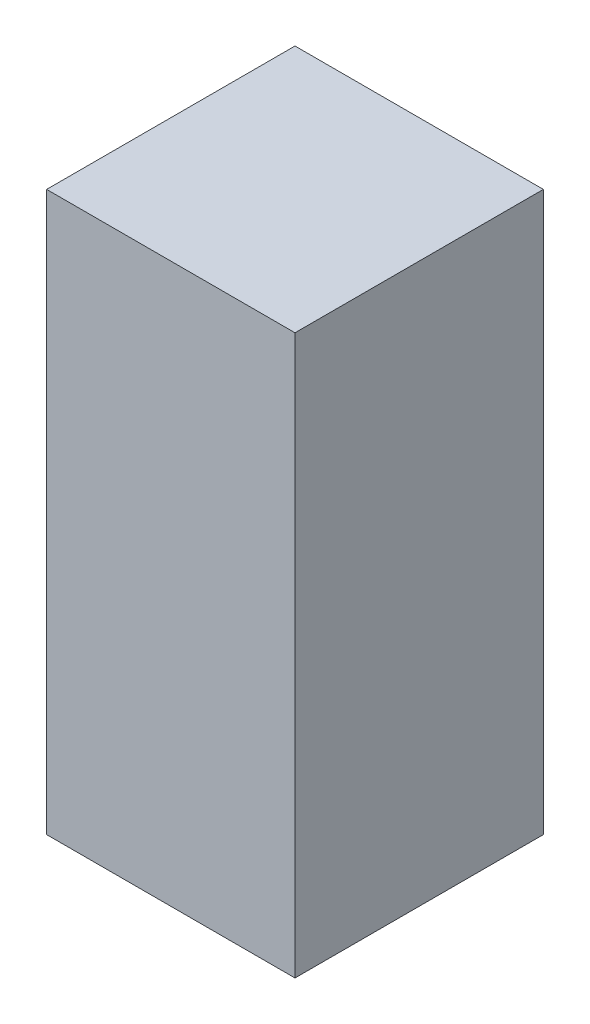
ISO-10303-21;
HEADER;
FILE_DESCRIPTION(('STEP AP214'),'2;1');
FILE_NAME('part.step','',(''),(''),'','','');
FILE_SCHEMA(('AUTOMOTIVE_DESIGN { 1 0 10303 214 1 1 1 1 }'));
ENDSEC;
DATA;
#1=APPLICATION_CONTEXT('core data for automotive mechanical design processes');
#2=APPLICATION_PROTOCOL_DEFINITION('international standard','automotive_design',2000,#1);
#3=PRODUCT_CONTEXT('',#1,'mechanical');
#4=PRODUCT('Part','Part','',(#3));
#5=PRODUCT_RELATED_PRODUCT_CATEGORY('part','',(#4));
#6=PRODUCT_DEFINITION_FORMATION('','',#4);
#7=PRODUCT_DEFINITION_CONTEXT('part definition',#1,'design');
#8=PRODUCT_DEFINITION('design','',#6,#7);
#9=PRODUCT_DEFINITION_SHAPE('','',#8);
#10=(LENGTH_UNIT() NAMED_UNIT(*) SI_UNIT(.MILLI.,.METRE.));
#11=(NAMED_UNIT(*) PLANE_ANGLE_UNIT() SI_UNIT($,.RADIAN.));
#12=(NAMED_UNIT(*) SI_UNIT($,.STERADIAN.) SOLID_ANGLE_UNIT());
#13=UNCERTAINTY_MEASURE_WITH_UNIT(LENGTH_MEASURE(1.E-05),#10,'distance_accuracy_value','');
#14=(GEOMETRIC_REPRESENTATION_CONTEXT(3) GLOBAL_UNCERTAINTY_ASSIGNED_CONTEXT((#13)) GLOBAL_UNIT_ASSIGNED_CONTEXT((#10,
#11,#12)) REPRESENTATION_CONTEXT('',''));
#15=CARTESIAN_POINT('',(0.,0.,0.));
#16=DIRECTION('',(0.,0.,1.));
#17=DIRECTION('',(1.,0.,0.));
#18=AXIS2_PLACEMENT_3D('',#15,#16,#17);
#19=CARTESIAN_POINT('',(502.5,552.,-247.5));
#20=DIRECTION('',(-1.,0.,0.));
#21=DIRECTION('',(0.,0.,1.));
#22=AXIS2_PLACEMENT_3D('',#19,#20,#21);
#23=PLANE('',#22);
#24=DIRECTION('',(0.,-1.,0.));
#25=VECTOR('',#24,1.);
#26=CARTESIAN_POINT('',(502.5,552.,-227.5));
#27=LINE('',#26,#25);
#28=CARTESIAN_POINT('',(502.5,597.,-227.5));
#29=VERTEX_POINT('',#28);
#30=CARTESIAN_POINT('',(502.5,552.,-227.5));
#31=VERTEX_POINT('',#30);
#32=EDGE_CURVE('E103',#29,#31,#27,.T.);
#33=ORIENTED_EDGE('',*,*,#32,.F.);
#34=DIRECTION('',(0.,0.,1.));
#35=VECTOR('',#34,1.);
#36=CARTESIAN_POINT('',(502.5,597.,-247.5));
#37=LINE('',#36,#35);
#38=CARTESIAN_POINT('',(502.5,597.,-247.5));
#39=VERTEX_POINT('',#38);
#40=EDGE_CURVE('E11',#39,#29,#37,.T.);
#41=ORIENTED_EDGE('',*,*,#40,.F.);
#42=DIRECTION('',(0.,-1.,0.));
#43=VECTOR('',#42,1.);
#44=CARTESIAN_POINT('',(502.5,552.,-247.5));
#45=LINE('',#44,#43);
#46=CARTESIAN_POINT('',(502.5,552.,-247.5));
#47=VERTEX_POINT('',#46);
#48=EDGE_CURVE('E97',#39,#47,#45,.T.);
#49=ORIENTED_EDGE('',*,*,#48,.T.);
#50=DIRECTION('',(0.,0.,1.));
#51=VECTOR('',#50,1.);
#52=CARTESIAN_POINT('',(502.5,552.,-247.5));
#53=LINE('',#52,#51);
#54=EDGE_CURVE('E42',#47,#31,#53,.T.);
#55=ORIENTED_EDGE('',*,*,#54,.T.);
#56=EDGE_LOOP('',(#33,#41,#49,#55));
#57=FACE_BOUND('',#56,.T.);
#58=ADVANCED_FACE('F39',(#57),#23,.T.);
#59=CARTESIAN_POINT('',(502.5,597.,-247.5));
#60=DIRECTION('',(0.,1.,0.));
#61=DIRECTION('',(0.,0.,1.));
#62=AXIS2_PLACEMENT_3D('',#59,#60,#61);
#63=PLANE('',#62);
#64=DIRECTION('',(-1.,0.,0.));
#65=VECTOR('',#64,1.);
#66=CARTESIAN_POINT('',(502.5,597.,-227.5));
#67=LINE('',#66,#65);
#68=CARTESIAN_POINT('',(522.5,597.,-227.5));
#69=VERTEX_POINT('',#68);
#70=EDGE_CURVE('E99',#69,#29,#67,.T.);
#71=ORIENTED_EDGE('',*,*,#70,.F.);
#72=DIRECTION('',(0.,0.,1.));
#73=VECTOR('',#72,1.);
#74=CARTESIAN_POINT('',(522.5,597.,-247.5));
#75=LINE('',#74,#73);
#76=CARTESIAN_POINT('',(522.5,597.,-247.5));
#77=VERTEX_POINT('',#76);
#78=EDGE_CURVE('E48',#77,#69,#75,.T.);
#79=ORIENTED_EDGE('',*,*,#78,.F.);
#80=DIRECTION('',(-1.,0.,0.));
#81=VECTOR('',#80,1.);
#82=CARTESIAN_POINT('',(502.5,597.,-247.5));
#83=LINE('',#82,#81);
#84=EDGE_CURVE('E94',#77,#39,#83,.T.);
#85=ORIENTED_EDGE('',*,*,#84,.T.);
#86=ORIENTED_EDGE('',*,*,#40,.T.);
#87=EDGE_LOOP('',(#71,#79,#85,#86));
#88=FACE_BOUND('',#87,.T.);
#89=ADVANCED_FACE('F113',(#88),#63,.T.);
#90=CARTESIAN_POINT('',(522.5,552.,-247.5));
#91=DIRECTION('',(1.,0.,0.));
#92=DIRECTION('',(0.,0.,-1.));
#93=AXIS2_PLACEMENT_3D('',#90,#91,#92);
#94=PLANE('',#93);
#95=DIRECTION('',(0.,1.,0.));
#96=VECTOR('',#95,1.);
#97=CARTESIAN_POINT('',(522.5,552.,-227.5));
#98=LINE('',#97,#96);
#99=CARTESIAN_POINT('',(522.5,552.,-227.5));
#100=VERTEX_POINT('',#99);
#101=EDGE_CURVE('E89',#100,#69,#98,.T.);
#102=ORIENTED_EDGE('',*,*,#101,.F.);
#103=DIRECTION('',(0.,0.,1.));
#104=VECTOR('',#103,1.);
#105=CARTESIAN_POINT('',(522.5,552.,-247.5));
#106=LINE('',#105,#104);
#107=CARTESIAN_POINT('',(522.5,552.,-247.5));
#108=VERTEX_POINT('',#107);
#109=EDGE_CURVE('E84',#108,#100,#106,.T.);
#110=ORIENTED_EDGE('',*,*,#109,.F.);
#111=DIRECTION('',(0.,1.,0.));
#112=VECTOR('',#111,1.);
#113=CARTESIAN_POINT('',(522.5,552.,-247.5));
#114=LINE('',#113,#112);
#115=EDGE_CURVE('E87',#108,#77,#114,.T.);
#116=ORIENTED_EDGE('',*,*,#115,.T.);
#117=ORIENTED_EDGE('',*,*,#78,.T.);
#118=EDGE_LOOP('',(#102,#110,#116,#117));
#119=FACE_BOUND('',#118,.T.);
#120=ADVANCED_FACE('F86',(#119),#94,.T.);
#121=CARTESIAN_POINT('',(502.5,552.,-247.5));
#122=DIRECTION('',(0.,-1.,0.));
#123=DIRECTION('',(0.,0.,-1.));
#124=AXIS2_PLACEMENT_3D('',#121,#122,#123);
#125=PLANE('',#124);
#126=DIRECTION('',(1.,0.,0.));
#127=VECTOR('',#126,1.);
#128=CARTESIAN_POINT('',(502.5,552.,-227.5));
#129=LINE('',#128,#127);
#130=EDGE_CURVE('E106',#31,#100,#129,.T.);
#131=ORIENTED_EDGE('',*,*,#130,.F.);
#132=ORIENTED_EDGE('',*,*,#54,.F.);
#133=DIRECTION('',(1.,0.,0.));
#134=VECTOR('',#133,1.);
#135=CARTESIAN_POINT('',(502.5,552.,-247.5));
#136=LINE('',#135,#134);
#137=EDGE_CURVE('E93',#47,#108,#136,.T.);
#138=ORIENTED_EDGE('',*,*,#137,.T.);
#139=ORIENTED_EDGE('',*,*,#109,.T.);
#140=EDGE_LOOP('',(#131,#132,#138,#139));
#141=FACE_BOUND('',#140,.T.);
#142=ADVANCED_FACE('F96',(#141),#125,.T.);
#143=CARTESIAN_POINT('',(0.,0.,-247.5));
#144=DIRECTION('',(0.,0.,-1.));
#145=DIRECTION('',(-1.,0.,0.));
#146=AXIS2_PLACEMENT_3D('',#143,#144,#145);
#147=PLANE('',#146);
#148=ORIENTED_EDGE('',*,*,#48,.F.);
#149=ORIENTED_EDGE('',*,*,#84,.F.);
#150=ORIENTED_EDGE('',*,*,#115,.F.);
#151=ORIENTED_EDGE('',*,*,#137,.F.);
#152=EDGE_LOOP('',(#148,#149,#150,#151));
#153=FACE_BOUND('',#152,.T.);
#154=ADVANCED_FACE('F92',(#153),#147,.T.);
#155=CARTESIAN_POINT('',(0.,0.,-227.5));
#156=DIRECTION('',(0.,0.,-1.));
#157=DIRECTION('',(-1.,0.,0.));
#158=AXIS2_PLACEMENT_3D('',#155,#156,#157);
#159=PLANE('',#158);
#160=ORIENTED_EDGE('',*,*,#32,.T.);
#161=ORIENTED_EDGE('',*,*,#130,.T.);
#162=ORIENTED_EDGE('',*,*,#101,.T.);
#163=ORIENTED_EDGE('',*,*,#70,.T.);
#164=EDGE_LOOP('',(#160,#161,#162,#163));
#165=FACE_BOUND('',#164,.T.);
#166=ADVANCED_FACE('F112',(#165),#159,.F.);
#167=CLOSED_SHELL('',(#58,#89,#120,#142,#154,#166));
#168=MANIFOLD_SOLID_BREP('B2',#167);
#169=ADVANCED_BREP_SHAPE_REPRESENTATION('',(#18,#168),#14);
#170=SHAPE_DEFINITION_REPRESENTATION(#9,#169);
ENDSEC;
END-ISO-10303-21;
